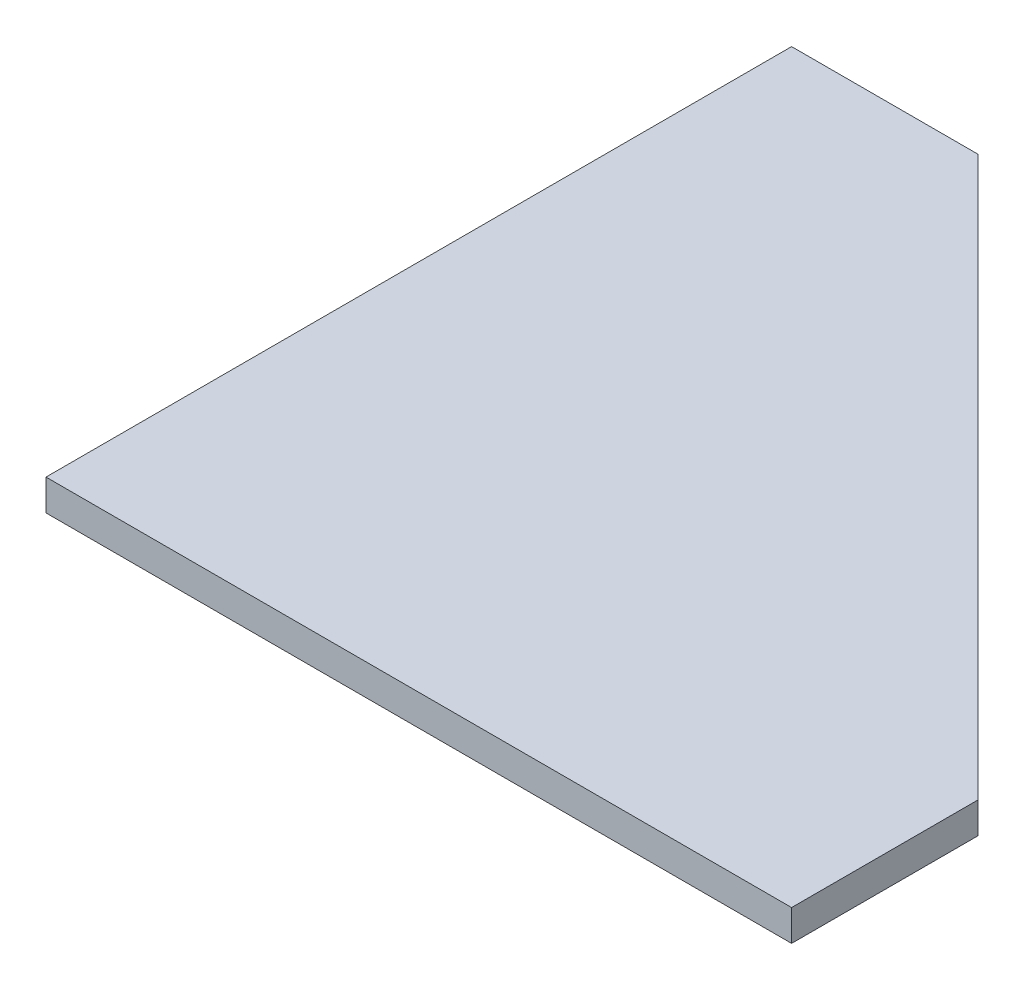
ISO-10303-21;
HEADER;
FILE_DESCRIPTION(('STEP AP214'),'2;1');
FILE_NAME('part.step','',(''),(''),'','','');
FILE_SCHEMA(('AUTOMOTIVE_DESIGN { 1 0 10303 214 1 1 1 1 }'));
ENDSEC;
DATA;
#1=APPLICATION_CONTEXT('core data for automotive mechanical design processes');
#2=APPLICATION_PROTOCOL_DEFINITION('international standard','automotive_design',2000,#1);
#3=PRODUCT_CONTEXT('',#1,'mechanical');
#4=PRODUCT('Part','Part','',(#3));
#5=PRODUCT_RELATED_PRODUCT_CATEGORY('part','',(#4));
#6=PRODUCT_DEFINITION_FORMATION('','',#4);
#7=PRODUCT_DEFINITION_CONTEXT('part definition',#1,'design');
#8=PRODUCT_DEFINITION('design','',#6,#7);
#9=PRODUCT_DEFINITION_SHAPE('','',#8);
#10=(LENGTH_UNIT() NAMED_UNIT(*) SI_UNIT(.MILLI.,.METRE.));
#11=(NAMED_UNIT(*) PLANE_ANGLE_UNIT() SI_UNIT($,.RADIAN.));
#12=(NAMED_UNIT(*) SI_UNIT($,.STERADIAN.) SOLID_ANGLE_UNIT());
#13=UNCERTAINTY_MEASURE_WITH_UNIT(LENGTH_MEASURE(1.E-05),#10,'distance_accuracy_value','');
#14=(GEOMETRIC_REPRESENTATION_CONTEXT(3) GLOBAL_UNCERTAINTY_ASSIGNED_CONTEXT((#13)) GLOBAL_UNIT_ASSIGNED_CONTEXT((#10,
#11,#12)) REPRESENTATION_CONTEXT('',''));
#15=CARTESIAN_POINT('',(0.,0.,0.));
#16=DIRECTION('',(0.,0.,1.));
#17=DIRECTION('',(1.,0.,0.));
#18=AXIS2_PLACEMENT_3D('',#15,#16,#17);
#19=CARTESIAN_POINT('',(152.4,6.35,0.));
#20=DIRECTION('',(0.,0.,-1.));
#21=DIRECTION('',(-1.,0.,0.));
#22=AXIS2_PLACEMENT_3D('',#19,#20,#21);
#23=PLANE('',#22);
#24=DIRECTION('',(1.,0.,0.));
#25=VECTOR('',#24,1.);
#26=CARTESIAN_POINT('',(152.4,0.,0.));
#27=LINE('',#26,#25);
#28=CARTESIAN_POINT('',(0.,0.,0.));
#29=VERTEX_POINT('',#28);
#30=CARTESIAN_POINT('',(152.4,0.,0.));
#31=VERTEX_POINT('',#30);
#32=EDGE_CURVE('E107',#29,#31,#27,.T.);
#33=ORIENTED_EDGE('',*,*,#32,.T.);
#34=DIRECTION('',(0.,-1.,0.));
#35=VECTOR('',#34,1.);
#36=CARTESIAN_POINT('',(152.4,6.35,0.));
#37=LINE('',#36,#35);
#38=CARTESIAN_POINT('',(152.4,6.35,0.));
#39=VERTEX_POINT('',#38);
#40=EDGE_CURVE('E11',#39,#31,#37,.T.);
#41=ORIENTED_EDGE('',*,*,#40,.F.);
#42=DIRECTION('',(1.,0.,0.));
#43=VECTOR('',#42,1.);
#44=CARTESIAN_POINT('',(152.4,6.35,0.));
#45=LINE('',#44,#43);
#46=CARTESIAN_POINT('',(0.,6.35,0.));
#47=VERTEX_POINT('',#46);
#48=EDGE_CURVE('E115',#47,#39,#45,.T.);
#49=ORIENTED_EDGE('',*,*,#48,.F.);
#50=DIRECTION('',(0.,-1.,0.));
#51=VECTOR('',#50,1.);
#52=CARTESIAN_POINT('',(0.,6.35,0.));
#53=LINE('',#52,#51);
#54=EDGE_CURVE('E103',#47,#29,#53,.T.);
#55=ORIENTED_EDGE('',*,*,#54,.T.);
#56=EDGE_LOOP('',(#33,#41,#49,#55));
#57=FACE_BOUND('',#56,.T.);
#58=ADVANCED_FACE('F33',(#57),#23,.F.);
#59=CARTESIAN_POINT('',(152.4,6.35,-38.1));
#60=DIRECTION('',(-1.,0.,0.));
#61=DIRECTION('',(0.,0.,1.));
#62=AXIS2_PLACEMENT_3D('',#59,#60,#61);
#63=PLANE('',#62);
#64=DIRECTION('',(0.,0.,-1.));
#65=VECTOR('',#64,1.);
#66=CARTESIAN_POINT('',(152.4,0.,-38.1));
#67=LINE('',#66,#65);
#68=CARTESIAN_POINT('',(152.4,0.,-38.1));
#69=VERTEX_POINT('',#68);
#70=EDGE_CURVE('E110',#31,#69,#67,.T.);
#71=ORIENTED_EDGE('',*,*,#70,.T.);
#72=DIRECTION('',(0.,-1.,0.));
#73=VECTOR('',#72,1.);
#74=CARTESIAN_POINT('',(152.4,6.35,-38.1));
#75=LINE('',#74,#73);
#76=CARTESIAN_POINT('',(152.4,6.35,-38.1));
#77=VERTEX_POINT('',#76);
#78=EDGE_CURVE('E41',#77,#69,#75,.T.);
#79=ORIENTED_EDGE('',*,*,#78,.F.);
#80=DIRECTION('',(0.,0.,-1.));
#81=VECTOR('',#80,1.);
#82=CARTESIAN_POINT('',(152.4,6.35,-38.1));
#83=LINE('',#82,#81);
#84=EDGE_CURVE('E83',#39,#77,#83,.T.);
#85=ORIENTED_EDGE('',*,*,#84,.F.);
#86=ORIENTED_EDGE('',*,*,#40,.T.);
#87=EDGE_LOOP('',(#71,#79,#85,#86));
#88=FACE_BOUND('',#87,.T.);
#89=ADVANCED_FACE('F134',(#88),#63,.F.);
#90=CARTESIAN_POINT('',(38.1,6.35,-152.4));
#91=DIRECTION('',(-0.707106781186548,0.,0.707106781186547));
#92=DIRECTION('',(0.707106781186547,0.,0.707106781186548));
#93=AXIS2_PLACEMENT_3D('',#90,#91,#92);
#94=PLANE('',#93);
#95=DIRECTION('',(-0.707106781186547,0.,-0.707106781186548));
#96=VECTOR('',#95,1.);
#97=CARTESIAN_POINT('',(38.1,0.,-152.4));
#98=LINE('',#97,#96);
#99=CARTESIAN_POINT('',(38.1,0.,-152.4));
#100=VERTEX_POINT('',#99);
#101=EDGE_CURVE('E98',#69,#100,#98,.T.);
#102=ORIENTED_EDGE('',*,*,#101,.T.);
#103=DIRECTION('',(0.,-1.,0.));
#104=VECTOR('',#103,1.);
#105=CARTESIAN_POINT('',(38.1,6.35,-152.4));
#106=LINE('',#105,#104);
#107=CARTESIAN_POINT('',(38.1,6.35,-152.4));
#108=VERTEX_POINT('',#107);
#109=EDGE_CURVE('E95',#108,#100,#106,.T.);
#110=ORIENTED_EDGE('',*,*,#109,.F.);
#111=DIRECTION('',(-0.707106781186547,0.,-0.707106781186548));
#112=VECTOR('',#111,1.);
#113=CARTESIAN_POINT('',(38.1,6.35,-152.4));
#114=LINE('',#113,#112);
#115=EDGE_CURVE('E87',#77,#108,#114,.T.);
#116=ORIENTED_EDGE('',*,*,#115,.F.);
#117=ORIENTED_EDGE('',*,*,#78,.T.);
#118=EDGE_LOOP('',(#102,#110,#116,#117));
#119=FACE_BOUND('',#118,.T.);
#120=ADVANCED_FACE('F96',(#119),#94,.F.);
#121=CARTESIAN_POINT('',(0.,6.35,-152.4));
#122=DIRECTION('',(0.,0.,1.));
#123=DIRECTION('',(1.,0.,0.));
#124=AXIS2_PLACEMENT_3D('',#121,#122,#123);
#125=PLANE('',#124);
#126=DIRECTION('',(-1.,0.,0.));
#127=VECTOR('',#126,1.);
#128=CARTESIAN_POINT('',(0.,0.,-152.4));
#129=LINE('',#128,#127);
#130=CARTESIAN_POINT('',(0.,0.,-152.4));
#131=VERTEX_POINT('',#130);
#132=EDGE_CURVE('E69',#100,#131,#129,.T.);
#133=ORIENTED_EDGE('',*,*,#132,.T.);
#134=DIRECTION('',(0.,-1.,0.));
#135=VECTOR('',#134,1.);
#136=CARTESIAN_POINT('',(0.,6.35,-152.4));
#137=LINE('',#136,#135);
#138=CARTESIAN_POINT('',(0.,6.35,-152.4));
#139=VERTEX_POINT('',#138);
#140=EDGE_CURVE('E99',#139,#131,#137,.T.);
#141=ORIENTED_EDGE('',*,*,#140,.F.);
#142=DIRECTION('',(-1.,0.,0.));
#143=VECTOR('',#142,1.);
#144=CARTESIAN_POINT('',(0.,6.35,-152.4));
#145=LINE('',#144,#143);
#146=EDGE_CURVE('E91',#108,#139,#145,.T.);
#147=ORIENTED_EDGE('',*,*,#146,.F.);
#148=ORIENTED_EDGE('',*,*,#109,.T.);
#149=EDGE_LOOP('',(#133,#141,#147,#148));
#150=FACE_BOUND('',#149,.T.);
#151=ADVANCED_FACE('F101',(#150),#125,.F.);
#152=CARTESIAN_POINT('',(0.,6.35,0.));
#153=DIRECTION('',(1.,0.,0.));
#154=DIRECTION('',(0.,0.,-1.));
#155=AXIS2_PLACEMENT_3D('',#152,#153,#154);
#156=PLANE('',#155);
#157=DIRECTION('',(0.,0.,1.));
#158=VECTOR('',#157,1.);
#159=CARTESIAN_POINT('',(0.,0.,0.));
#160=LINE('',#159,#158);
#161=EDGE_CURVE('E75',#131,#29,#160,.T.);
#162=ORIENTED_EDGE('',*,*,#161,.T.);
#163=ORIENTED_EDGE('',*,*,#54,.F.);
#164=DIRECTION('',(0.,0.,1.));
#165=VECTOR('',#164,1.);
#166=CARTESIAN_POINT('',(0.,6.35,0.));
#167=LINE('',#166,#165);
#168=EDGE_CURVE('E49',#139,#47,#167,.T.);
#169=ORIENTED_EDGE('',*,*,#168,.F.);
#170=ORIENTED_EDGE('',*,*,#140,.T.);
#171=EDGE_LOOP('',(#162,#163,#169,#170));
#172=FACE_BOUND('',#171,.T.);
#173=ADVANCED_FACE('F123',(#172),#156,.F.);
#174=CARTESIAN_POINT('',(0.,6.35,0.));
#175=DIRECTION('',(0.,-1.,0.));
#176=DIRECTION('',(0.,0.,-1.));
#177=AXIS2_PLACEMENT_3D('',#174,#175,#176);
#178=PLANE('',#177);
#179=ORIENTED_EDGE('',*,*,#48,.T.);
#180=ORIENTED_EDGE('',*,*,#84,.T.);
#181=ORIENTED_EDGE('',*,*,#115,.T.);
#182=ORIENTED_EDGE('',*,*,#146,.T.);
#183=ORIENTED_EDGE('',*,*,#168,.T.);
#184=EDGE_LOOP('',(#179,#180,#181,#182,#183));
#185=FACE_BOUND('',#184,.T.);
#186=ADVANCED_FACE('F89',(#185),#178,.F.);
#187=CARTESIAN_POINT('',(0.,0.,0.));
#188=DIRECTION('',(0.,-1.,0.));
#189=DIRECTION('',(0.,0.,-1.));
#190=AXIS2_PLACEMENT_3D('',#187,#188,#189);
#191=PLANE('',#190);
#192=ORIENTED_EDGE('',*,*,#32,.F.);
#193=ORIENTED_EDGE('',*,*,#161,.F.);
#194=ORIENTED_EDGE('',*,*,#132,.F.);
#195=ORIENTED_EDGE('',*,*,#101,.F.);
#196=ORIENTED_EDGE('',*,*,#70,.F.);
#197=EDGE_LOOP('',(#192,#193,#194,#195,#196));
#198=FACE_BOUND('',#197,.T.);
#199=ADVANCED_FACE('F119',(#198),#191,.T.);
#200=CLOSED_SHELL('',(#58,#89,#120,#151,#173,#186,#199));
#201=MANIFOLD_SOLID_BREP('B2',#200);
#202=ADVANCED_BREP_SHAPE_REPRESENTATION('',(#18,#201),#14);
#203=SHAPE_DEFINITION_REPRESENTATION(#9,#202);
ENDSEC;
END-ISO-10303-21;
